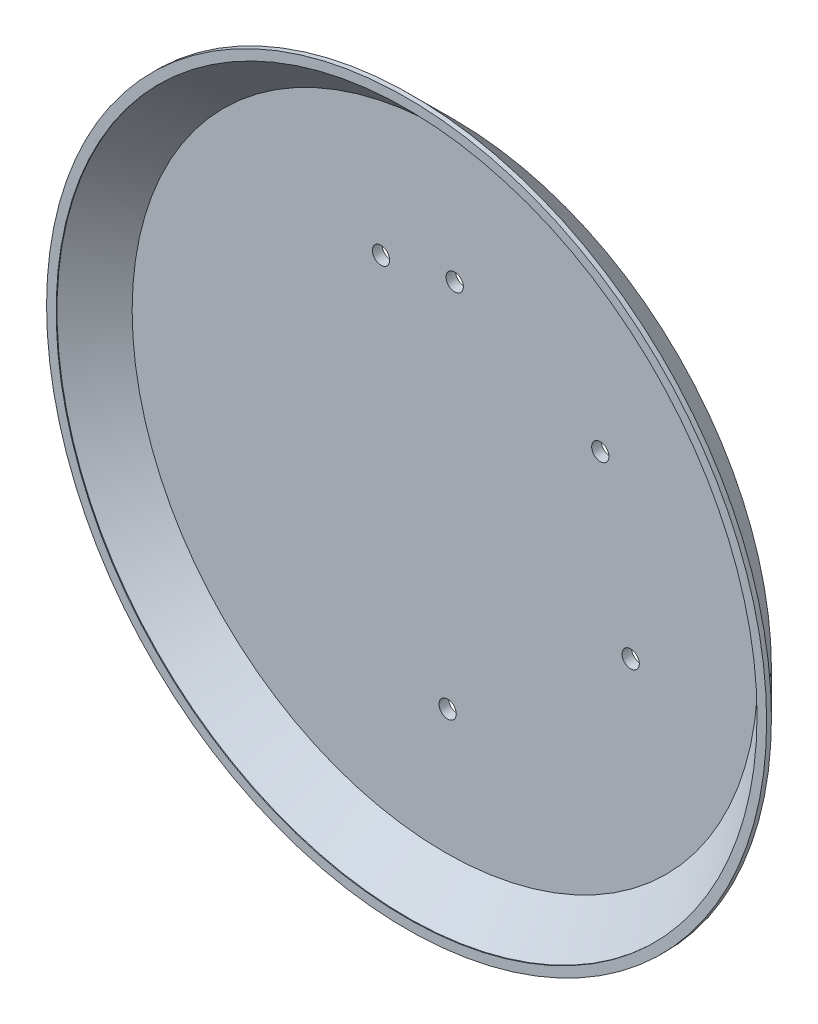
ISO-10303-21;
HEADER;
FILE_DESCRIPTION(('STEP AP214'),'2;1');
FILE_NAME('part.step','',(''),(''),'','','');
FILE_SCHEMA(('AUTOMOTIVE_DESIGN { 1 0 10303 214 1 1 1 1 }'));
ENDSEC;
DATA;
#1=APPLICATION_CONTEXT('core data for automotive mechanical design processes');
#2=APPLICATION_PROTOCOL_DEFINITION('international standard','automotive_design',2000,#1);
#3=PRODUCT_CONTEXT('',#1,'mechanical');
#4=PRODUCT('Part','Part','',(#3));
#5=PRODUCT_RELATED_PRODUCT_CATEGORY('part','',(#4));
#6=PRODUCT_DEFINITION_FORMATION('','',#4);
#7=PRODUCT_DEFINITION_CONTEXT('part definition',#1,'design');
#8=PRODUCT_DEFINITION('design','',#6,#7);
#9=PRODUCT_DEFINITION_SHAPE('','',#8);
#10=(LENGTH_UNIT() NAMED_UNIT(*) SI_UNIT(.MILLI.,.METRE.));
#11=(NAMED_UNIT(*) PLANE_ANGLE_UNIT() SI_UNIT($,.RADIAN.));
#12=(NAMED_UNIT(*) SI_UNIT($,.STERADIAN.) SOLID_ANGLE_UNIT());
#13=UNCERTAINTY_MEASURE_WITH_UNIT(LENGTH_MEASURE(1.E-05),#10,'distance_accuracy_value','');
#14=(GEOMETRIC_REPRESENTATION_CONTEXT(3) GLOBAL_UNCERTAINTY_ASSIGNED_CONTEXT((#13)) GLOBAL_UNIT_ASSIGNED_CONTEXT((#10,
#11,#12)) REPRESENTATION_CONTEXT('',''));
#15=CARTESIAN_POINT('',(0.,0.,0.));
#16=DIRECTION('',(0.,0.,1.));
#17=DIRECTION('',(1.,0.,0.));
#18=AXIS2_PLACEMENT_3D('',#15,#16,#17);
#19=CARTESIAN_POINT('',(0.,0.,10.));
#20=DIRECTION('',(0.,0.,-1.));
#21=DIRECTION('',(-1.,0.,0.));
#22=AXIS2_PLACEMENT_3D('',#19,#20,#21);
#23=CYLINDRICAL_SURFACE('',#22,75.);
#24=CARTESIAN_POINT('',(0.,0.,8.99999999999999));
#25=DIRECTION('',(0.,0.,1.));
#26=DIRECTION('',(1.,0.,0.));
#27=AXIS2_PLACEMENT_3D('',#24,#25,#26);
#28=CIRCLE('',#27,75.);
#29=CARTESIAN_POINT('',(75.,0.,8.99999999999999));
#30=VERTEX_POINT('',#29);
#31=EDGE_CURVE('E45',#30,#30,#28,.T.);
#32=ORIENTED_EDGE('',*,*,#31,.T.);
#33=EDGE_LOOP('',(#32));
#34=FACE_BOUND('',#33,.T.);
#35=CARTESIAN_POINT('',(0.,0.,10.));
#36=DIRECTION('',(0.,0.,1.));
#37=DIRECTION('',(1.,0.,0.));
#38=AXIS2_PLACEMENT_3D('',#35,#36,#37);
#39=CIRCLE('',#38,75.);
#40=CARTESIAN_POINT('',(75.,0.,10.));
#41=VERTEX_POINT('',#40);
#42=EDGE_CURVE('E49',#41,#41,#39,.T.);
#43=ORIENTED_EDGE('',*,*,#42,.F.);
#44=EDGE_LOOP('',(#43));
#45=FACE_BOUND('',#44,.T.);
#46=ADVANCED_FACE('F37',(#34,#45),#23,.T.);
#47=CARTESIAN_POINT('',(0.,0.,10.));
#48=DIRECTION('',(0.,0.,1.));
#49=DIRECTION('',(1.,0.,0.));
#50=AXIS2_PLACEMENT_3D('',#47,#48,#49);
#51=PLANE('',#50);
#52=CARTESIAN_POINT('',(0.,0.,10.));
#53=DIRECTION('',(0.,0.,1.));
#54=DIRECTION('',(1.,0.,0.));
#55=AXIS2_PLACEMENT_3D('',#52,#53,#54);
#56=CIRCLE('',#55,73.);
#57=CARTESIAN_POINT('',(73.,0.,10.));
#58=VERTEX_POINT('',#57);
#59=EDGE_CURVE('E56',#58,#58,#56,.T.);
#60=ORIENTED_EDGE('',*,*,#59,.F.);
#61=EDGE_LOOP('',(#60));
#62=FACE_BOUND('',#61,.T.);
#63=ORIENTED_EDGE('',*,*,#42,.T.);
#64=EDGE_LOOP('',(#63));
#65=FACE_BOUND('',#64,.T.);
#66=ADVANCED_FACE('F119',(#62,#65),#51,.T.);
#67=CARTESIAN_POINT('',(0.,0.,0.));
#68=DIRECTION('',(0.,0.,1.));
#69=DIRECTION('',(1.,0.,0.));
#70=AXIS2_PLACEMENT_3D('',#67,#68,#69);
#71=PLANE('',#70);
#72=CARTESIAN_POINT('',(32.3464027605883,23.3111645098416,0.));
#73=DIRECTION('',(0.,0.,1.));
#74=DIRECTION('',(1.,0.,0.));
#75=AXIS2_PLACEMENT_3D('',#72,#73,#74);
#76=CIRCLE('',#75,1.79999999999999);
#77=CARTESIAN_POINT('',(34.1464027605883,23.3111645098416,0.));
#78=VERTEX_POINT('',#77);
#79=EDGE_CURVE('E71',#78,#78,#76,.T.);
#80=ORIENTED_EDGE('',*,*,#79,.T.);
#81=EDGE_LOOP('',(#80));
#82=FACE_BOUND('',#81,.T.);
#83=CARTESIAN_POINT('',(38.6723515062541,-10.9090433864762,0.));
#84=DIRECTION('',(0.,0.,1.));
#85=DIRECTION('',(1.,0.,0.));
#86=AXIS2_PLACEMENT_3D('',#83,#84,#85);
#87=CIRCLE('',#86,1.80000000000002);
#88=CARTESIAN_POINT('',(40.4723515062541,-10.9090433864762,0.));
#89=VERTEX_POINT('',#88);
#90=EDGE_CURVE('E77',#89,#89,#87,.T.);
#91=ORIENTED_EDGE('',*,*,#90,.T.);
#92=EDGE_LOOP('',(#91));
#93=FACE_BOUND('',#92,.T.);
#94=CARTESIAN_POINT('',(0.548769326816911,-39.0312801006443,0.));
#95=DIRECTION('',(0.,0.,1.));
#96=DIRECTION('',(1.,0.,0.));
#97=AXIS2_PLACEMENT_3D('',#94,#95,#96);
#98=CIRCLE('',#97,1.80000000000003);
#99=CARTESIAN_POINT('',(2.34876932681694,-39.0312801006443,0.));
#100=VERTEX_POINT('',#99);
#101=EDGE_CURVE('E83',#100,#100,#98,.T.);
#102=ORIENTED_EDGE('',*,*,#101,.T.);
#103=EDGE_LOOP('',(#102));
#104=FACE_BOUND('',#103,.T.);
#105=CARTESIAN_POINT('',(-13.3254537524504,35.9000760057731,0.));
#106=DIRECTION('',(0.,0.,1.));
#107=DIRECTION('',(1.,0.,0.));
#108=AXIS2_PLACEMENT_3D('',#105,#106,#107);
#109=CIRCLE('',#108,1.8);
#110=CARTESIAN_POINT('',(-11.5254537524505,35.9000760057731,0.));
#111=VERTEX_POINT('',#110);
#112=EDGE_CURVE('E89',#111,#111,#109,.T.);
#113=ORIENTED_EDGE('',*,*,#112,.T.);
#114=EDGE_LOOP('',(#113));
#115=FACE_BOUND('',#114,.T.);
#116=CARTESIAN_POINT('',(2.0150786332446,38.7554264437126,0.));
#117=DIRECTION('',(0.,0.,1.));
#118=DIRECTION('',(1.,0.,0.));
#119=AXIS2_PLACEMENT_3D('',#116,#117,#118);
#120=CIRCLE('',#119,1.8);
#121=CARTESIAN_POINT('',(3.8150786332446,38.7554264437126,0.));
#122=VERTEX_POINT('',#121);
#123=EDGE_CURVE('E60',#122,#122,#120,.T.);
#124=ORIENTED_EDGE('',*,*,#123,.T.);
#125=EDGE_LOOP('',(#124));
#126=FACE_BOUND('',#125,.T.);
#127=CARTESIAN_POINT('',(0.,0.,0.));
#128=DIRECTION('',(0.,0.,1.));
#129=DIRECTION('',(1.,0.,0.));
#130=AXIS2_PLACEMENT_3D('',#127,#128,#129);
#131=CIRCLE('',#130,66.);
#132=CARTESIAN_POINT('',(66.,0.,0.));
#133=VERTEX_POINT('',#132);
#134=EDGE_CURVE('E10',#133,#133,#131,.F.);
#135=ORIENTED_EDGE('',*,*,#134,.T.);
#136=EDGE_LOOP('',(#135));
#137=FACE_BOUND('',#136,.T.);
#138=ADVANCED_FACE('F122',(#82,#93,#104,#115,#126,#137),#71,.F.);
#139=CARTESIAN_POINT('',(0.,0.,8.99999999999999));
#140=DIRECTION('',(0.,0.,1.));
#141=DIRECTION('',(1.,0.,0.));
#142=AXIS2_PLACEMENT_3D('',#139,#140,#141);
#143=CONICAL_SURFACE('',#142,75.,0.78539816339745);
#144=ORIENTED_EDGE('',*,*,#134,.F.);
#145=EDGE_LOOP('',(#144));
#146=FACE_BOUND('',#145,.T.);
#147=ORIENTED_EDGE('',*,*,#31,.F.);
#148=EDGE_LOOP('',(#147));
#149=FACE_BOUND('',#148,.T.);
#150=ADVANCED_FACE('F40',(#146,#149),#143,.T.);
#151=CARTESIAN_POINT('',(0.,0.,10.));
#152=DIRECTION('',(0.,0.,-1.));
#153=DIRECTION('',(-1.,0.,0.));
#154=AXIS2_PLACEMENT_3D('',#151,#152,#153);
#155=CYLINDRICAL_SURFACE('',#154,73.);
#156=CARTESIAN_POINT('',(0.,0.,9.82842712474618));
#157=DIRECTION('',(0.,0.,1.));
#158=DIRECTION('',(1.,0.,0.));
#159=AXIS2_PLACEMENT_3D('',#156,#157,#158);
#160=CIRCLE('',#159,73.);
#161=CARTESIAN_POINT('',(73.,0.,9.82842712474618));
#162=VERTEX_POINT('',#161);
#163=EDGE_CURVE('E59',#162,#162,#160,.T.);
#164=ORIENTED_EDGE('',*,*,#163,.F.);
#165=EDGE_LOOP('',(#164));
#166=FACE_BOUND('',#165,.T.);
#167=ORIENTED_EDGE('',*,*,#59,.T.);
#168=EDGE_LOOP('',(#167));
#169=FACE_BOUND('',#168,.T.);
#170=ADVANCED_FACE('F101',(#166,#169),#155,.F.);
#171=CARTESIAN_POINT('',(0.,0.,2.));
#172=DIRECTION('',(0.,0.,1.));
#173=DIRECTION('',(1.,0.,0.));
#174=AXIS2_PLACEMENT_3D('',#171,#172,#173);
#175=PLANE('',#174);
#176=CARTESIAN_POINT('',(32.3464027605883,23.3111645098416,2.));
#177=DIRECTION('',(0.,0.,1.));
#178=DIRECTION('',(1.,0.,0.));
#179=AXIS2_PLACEMENT_3D('',#176,#177,#178);
#180=CIRCLE('',#179,1.79999999999999);
#181=CARTESIAN_POINT('',(34.1464027605883,23.3111645098416,2.));
#182=VERTEX_POINT('',#181);
#183=EDGE_CURVE('E74',#182,#182,#180,.T.);
#184=ORIENTED_EDGE('',*,*,#183,.F.);
#185=EDGE_LOOP('',(#184));
#186=FACE_BOUND('',#185,.T.);
#187=CARTESIAN_POINT('',(38.6723515062541,-10.9090433864762,2.));
#188=DIRECTION('',(0.,0.,1.));
#189=DIRECTION('',(1.,0.,0.));
#190=AXIS2_PLACEMENT_3D('',#187,#188,#189);
#191=CIRCLE('',#190,1.80000000000002);
#192=CARTESIAN_POINT('',(40.4723515062541,-10.9090433864762,2.));
#193=VERTEX_POINT('',#192);
#194=EDGE_CURVE('E80',#193,#193,#191,.T.);
#195=ORIENTED_EDGE('',*,*,#194,.F.);
#196=EDGE_LOOP('',(#195));
#197=FACE_BOUND('',#196,.T.);
#198=CARTESIAN_POINT('',(0.548769326816911,-39.0312801006443,2.));
#199=DIRECTION('',(0.,0.,1.));
#200=DIRECTION('',(1.,0.,0.));
#201=AXIS2_PLACEMENT_3D('',#198,#199,#200);
#202=CIRCLE('',#201,1.80000000000003);
#203=CARTESIAN_POINT('',(2.34876932681694,-39.0312801006443,2.));
#204=VERTEX_POINT('',#203);
#205=EDGE_CURVE('E86',#204,#204,#202,.T.);
#206=ORIENTED_EDGE('',*,*,#205,.F.);
#207=EDGE_LOOP('',(#206));
#208=FACE_BOUND('',#207,.T.);
#209=CARTESIAN_POINT('',(-13.3254537524504,35.9000760057731,2.));
#210=DIRECTION('',(0.,0.,1.));
#211=DIRECTION('',(1.,0.,0.));
#212=AXIS2_PLACEMENT_3D('',#209,#210,#211);
#213=CIRCLE('',#212,1.8);
#214=CARTESIAN_POINT('',(-11.5254537524505,35.9000760057731,2.));
#215=VERTEX_POINT('',#214);
#216=EDGE_CURVE('E68',#215,#215,#213,.T.);
#217=ORIENTED_EDGE('',*,*,#216,.F.);
#218=EDGE_LOOP('',(#217));
#219=FACE_BOUND('',#218,.T.);
#220=CARTESIAN_POINT('',(2.0150786332446,38.7554264437126,2.));
#221=DIRECTION('',(0.,0.,1.));
#222=DIRECTION('',(1.,0.,0.));
#223=AXIS2_PLACEMENT_3D('',#220,#221,#222);
#224=CIRCLE('',#223,1.8);
#225=CARTESIAN_POINT('',(3.8150786332446,38.7554264437126,2.));
#226=VERTEX_POINT('',#225);
#227=EDGE_CURVE('E65',#226,#226,#224,.T.);
#228=ORIENTED_EDGE('',*,*,#227,.F.);
#229=EDGE_LOOP('',(#228));
#230=FACE_BOUND('',#229,.T.);
#231=CARTESIAN_POINT('',(0.,0.,2.));
#232=DIRECTION('',(0.,0.,1.));
#233=DIRECTION('',(1.,0.,0.));
#234=AXIS2_PLACEMENT_3D('',#231,#232,#233);
#235=CIRCLE('',#234,65.1715728752538);
#236=CARTESIAN_POINT('',(65.1715728752538,0.,2.));
#237=VERTEX_POINT('',#236);
#238=EDGE_CURVE('E53',#237,#237,#235,.F.);
#239=ORIENTED_EDGE('',*,*,#238,.F.);
#240=EDGE_LOOP('',(#239));
#241=FACE_BOUND('',#240,.T.);
#242=ADVANCED_FACE('F97',(#186,#197,#208,#219,#230,#241),#175,.T.);
#243=CARTESIAN_POINT('',(0.,0.,10.4142135623731));
#244=DIRECTION('',(0.,0.,1.));
#245=DIRECTION('',(1.,0.,0.));
#246=AXIS2_PLACEMENT_3D('',#243,#244,#245);
#247=CONICAL_SURFACE('',#246,73.5857864376269,0.78539816339745);
#248=ORIENTED_EDGE('',*,*,#238,.T.);
#249=EDGE_LOOP('',(#248));
#250=FACE_BOUND('',#249,.T.);
#251=ORIENTED_EDGE('',*,*,#163,.T.);
#252=EDGE_LOOP('',(#251));
#253=FACE_BOUND('',#252,.T.);
#254=ADVANCED_FACE('F100',(#250,#253),#247,.F.);
#255=CARTESIAN_POINT('',(2.0150786332446,38.7554264437126,0.));
#256=DIRECTION('',(0.,0.,1.));
#257=DIRECTION('',(1.,0.,0.));
#258=AXIS2_PLACEMENT_3D('',#255,#256,#257);
#259=CYLINDRICAL_SURFACE('',#258,1.8);
#260=ORIENTED_EDGE('',*,*,#123,.F.);
#261=EDGE_LOOP('',(#260));
#262=FACE_BOUND('',#261,.T.);
#263=ORIENTED_EDGE('',*,*,#227,.T.);
#264=EDGE_LOOP('',(#263));
#265=FACE_BOUND('',#264,.T.);
#266=ADVANCED_FACE('F110',(#262,#265),#259,.F.);
#267=CARTESIAN_POINT('',(-13.3254537524504,35.9000760057731,0.));
#268=DIRECTION('',(0.,0.,1.));
#269=DIRECTION('',(1.,0.,0.));
#270=AXIS2_PLACEMENT_3D('',#267,#268,#269);
#271=CYLINDRICAL_SURFACE('',#270,1.8);
#272=ORIENTED_EDGE('',*,*,#112,.F.);
#273=EDGE_LOOP('',(#272));
#274=FACE_BOUND('',#273,.T.);
#275=ORIENTED_EDGE('',*,*,#216,.T.);
#276=EDGE_LOOP('',(#275));
#277=FACE_BOUND('',#276,.T.);
#278=ADVANCED_FACE('F95',(#274,#277),#271,.F.);
#279=CARTESIAN_POINT('',(0.548769326816911,-39.0312801006443,0.));
#280=DIRECTION('',(0.,0.,1.));
#281=DIRECTION('',(1.,0.,0.));
#282=AXIS2_PLACEMENT_3D('',#279,#280,#281);
#283=CYLINDRICAL_SURFACE('',#282,1.80000000000003);
#284=ORIENTED_EDGE('',*,*,#101,.F.);
#285=EDGE_LOOP('',(#284));
#286=FACE_BOUND('',#285,.T.);
#287=ORIENTED_EDGE('',*,*,#205,.T.);
#288=EDGE_LOOP('',(#287));
#289=FACE_BOUND('',#288,.T.);
#290=ADVANCED_FACE('F143',(#286,#289),#283,.F.);
#291=CARTESIAN_POINT('',(38.6723515062541,-10.9090433864762,0.));
#292=DIRECTION('',(0.,0.,1.));
#293=DIRECTION('',(1.,0.,0.));
#294=AXIS2_PLACEMENT_3D('',#291,#292,#293);
#295=CYLINDRICAL_SURFACE('',#294,1.80000000000002);
#296=ORIENTED_EDGE('',*,*,#90,.F.);
#297=EDGE_LOOP('',(#296));
#298=FACE_BOUND('',#297,.T.);
#299=ORIENTED_EDGE('',*,*,#194,.T.);
#300=EDGE_LOOP('',(#299));
#301=FACE_BOUND('',#300,.T.);
#302=ADVANCED_FACE('F139',(#298,#301),#295,.F.);
#303=CARTESIAN_POINT('',(32.3464027605883,23.3111645098416,0.));
#304=DIRECTION('',(0.,0.,1.));
#305=DIRECTION('',(1.,0.,0.));
#306=AXIS2_PLACEMENT_3D('',#303,#304,#305);
#307=CYLINDRICAL_SURFACE('',#306,1.79999999999999);
#308=ORIENTED_EDGE('',*,*,#79,.F.);
#309=EDGE_LOOP('',(#308));
#310=FACE_BOUND('',#309,.T.);
#311=ORIENTED_EDGE('',*,*,#183,.T.);
#312=EDGE_LOOP('',(#311));
#313=FACE_BOUND('',#312,.T.);
#314=ADVANCED_FACE('F136',(#310,#313),#307,.F.);
#315=CLOSED_SHELL('',(#46,#66,#138,#150,#170,#242,#254,#266,#278,#290,#302,#314));
#316=MANIFOLD_SOLID_BREP('B2',#315);
#317=ADVANCED_BREP_SHAPE_REPRESENTATION('',(#18,#316),#14);
#318=SHAPE_DEFINITION_REPRESENTATION(#9,#317);
ENDSEC;
END-ISO-10303-21;
